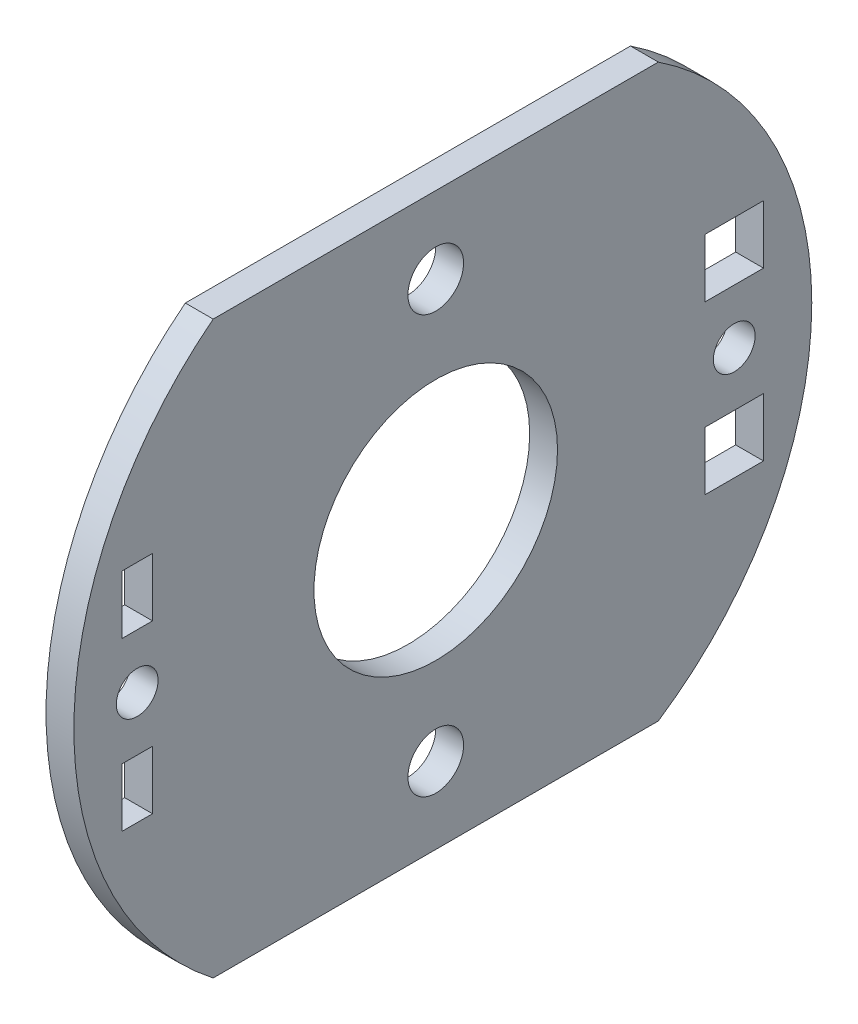
ISO-10303-21;
HEADER;
FILE_DESCRIPTION(('STEP AP214'),'2;1');
FILE_NAME('part.step','',(''),(''),'','','');
FILE_SCHEMA(('AUTOMOTIVE_DESIGN { 1 0 10303 214 1 1 1 1 }'));
ENDSEC;
DATA;
#1=APPLICATION_CONTEXT('core data for automotive mechanical design processes');
#2=APPLICATION_PROTOCOL_DEFINITION('international standard','automotive_design',2000,#1);
#3=PRODUCT_CONTEXT('',#1,'mechanical');
#4=PRODUCT('Part','Part','',(#3));
#5=PRODUCT_RELATED_PRODUCT_CATEGORY('part','',(#4));
#6=PRODUCT_DEFINITION_FORMATION('','',#4);
#7=PRODUCT_DEFINITION_CONTEXT('part definition',#1,'design');
#8=PRODUCT_DEFINITION('design','',#6,#7);
#9=PRODUCT_DEFINITION_SHAPE('','',#8);
#10=(LENGTH_UNIT() NAMED_UNIT(*) SI_UNIT(.MILLI.,.METRE.));
#11=(NAMED_UNIT(*) PLANE_ANGLE_UNIT() SI_UNIT($,.RADIAN.));
#12=(NAMED_UNIT(*) SI_UNIT($,.STERADIAN.) SOLID_ANGLE_UNIT());
#13=UNCERTAINTY_MEASURE_WITH_UNIT(LENGTH_MEASURE(1.E-05),#10,'distance_accuracy_value','');
#14=(GEOMETRIC_REPRESENTATION_CONTEXT(3) GLOBAL_UNCERTAINTY_ASSIGNED_CONTEXT((#13)) GLOBAL_UNIT_ASSIGNED_CONTEXT((#10,
#11,#12)) REPRESENTATION_CONTEXT('',''));
#15=CARTESIAN_POINT('',(0.,0.,0.));
#16=DIRECTION('',(0.,0.,1.));
#17=DIRECTION('',(1.,0.,0.));
#18=AXIS2_PLACEMENT_3D('',#15,#16,#17);
#19=CARTESIAN_POINT('',(2.,0.,-21.45));
#20=DIRECTION('',(-1.,0.,0.));
#21=DIRECTION('',(0.,0.,1.));
#22=AXIS2_PLACEMENT_3D('',#19,#20,#21);
#23=PLANE('',#22);
#24=DIRECTION('',(0.,0.,1.));
#25=VECTOR('',#24,1.);
#26=CARTESIAN_POINT('',(2.,-3.90000000000011,1.09999999999998));
#27=LINE('',#26,#25);
#28=CARTESIAN_POINT('',(2.,-3.9000000000001,-1.10000000000003));
#29=VERTEX_POINT('',#28);
#30=CARTESIAN_POINT('',(2.,-3.90000000000011,1.09999999999998));
#31=VERTEX_POINT('',#30);
#32=EDGE_CURVE('E211',#29,#31,#27,.T.);
#33=ORIENTED_EDGE('',*,*,#32,.F.);
#34=DIRECTION('',(0.,1.,0.));
#35=VECTOR('',#34,1.);
#36=CARTESIAN_POINT('',(2.,-3.9000000000001,-1.10000000000003));
#37=LINE('',#36,#35);
#38=CARTESIAN_POINT('',(2.,-8.1,-1.10000000000028));
#39=VERTEX_POINT('',#38);
#40=EDGE_CURVE('E219',#39,#29,#37,.T.);
#41=ORIENTED_EDGE('',*,*,#40,.F.);
#42=DIRECTION('',(0.,0.,-1.));
#43=VECTOR('',#42,1.);
#44=CARTESIAN_POINT('',(2.,-8.10000000000001,1.09999999999996));
#45=LINE('',#44,#43);
#46=CARTESIAN_POINT('',(2.,-8.10000000000001,1.09999999999996));
#47=VERTEX_POINT('',#46);
#48=EDGE_CURVE('E216',#47,#39,#45,.T.);
#49=ORIENTED_EDGE('',*,*,#48,.F.);
#50=DIRECTION('',(0.,-1.,0.));
#51=VECTOR('',#50,1.);
#52=CARTESIAN_POINT('',(2.,-3.90000000000011,1.09999999999998));
#53=LINE('',#52,#51);
#54=EDGE_CURVE('E213',#31,#47,#53,.T.);
#55=ORIENTED_EDGE('',*,*,#54,.F.);
#56=EDGE_LOOP('',(#33,#41,#49,#55));
#57=FACE_BOUND('',#56,.T.);
#58=CARTESIAN_POINT('',(2.,0.,-21.45));
#59=DIRECTION('',(1.,0.,0.));
#60=DIRECTION('',(0.,0.,-1.));
#61=AXIS2_PLACEMENT_3D('',#58,#59,#60);
#62=CIRCLE('',#61,8.75);
#63=CARTESIAN_POINT('',(2.,0.,-30.2));
#64=VERTEX_POINT('',#63);
#65=EDGE_CURVE('E273',#64,#64,#62,.T.);
#66=ORIENTED_EDGE('',*,*,#65,.F.);
#67=EDGE_LOOP('',(#66));
#68=FACE_BOUND('',#67,.T.);
#69=CARTESIAN_POINT('',(2.,-15.,-21.45));
#70=DIRECTION('',(1.,0.,0.));
#71=DIRECTION('',(0.,0.,-1.));
#72=AXIS2_PLACEMENT_3D('',#69,#70,#71);
#73=CIRCLE('',#72,2.);
#74=CARTESIAN_POINT('',(2.,-15.,-23.45));
#75=VERTEX_POINT('',#74);
#76=EDGE_CURVE('E279',#75,#75,#73,.T.);
#77=ORIENTED_EDGE('',*,*,#76,.F.);
#78=EDGE_LOOP('',(#77));
#79=FACE_BOUND('',#78,.T.);
#80=CARTESIAN_POINT('',(2.,15.,-21.45));
#81=DIRECTION('',(1.,0.,0.));
#82=DIRECTION('',(0.,0.,-1.));
#83=AXIS2_PLACEMENT_3D('',#80,#81,#82);
#84=CIRCLE('',#83,2.);
#85=CARTESIAN_POINT('',(2.,15.,-23.45));
#86=VERTEX_POINT('',#85);
#87=EDGE_CURVE('E285',#86,#86,#84,.T.);
#88=ORIENTED_EDGE('',*,*,#87,.F.);
#89=EDGE_LOOP('',(#88));
#90=FACE_BOUND('',#89,.T.);
#91=DIRECTION('',(0.,1.,0.));
#92=VECTOR('',#91,1.);
#93=CARTESIAN_POINT('',(2.,-3.90000000000006,-45.));
#94=LINE('',#93,#92);
#95=CARTESIAN_POINT('',(2.,-8.10000000000006,-45.));
#96=VERTEX_POINT('',#95);
#97=CARTESIAN_POINT('',(2.,-3.90000000000006,-45.));
#98=VERTEX_POINT('',#97);
#99=EDGE_CURVE('E291',#96,#98,#94,.T.);
#100=ORIENTED_EDGE('',*,*,#99,.F.);
#101=DIRECTION('',(0.,0.,-1.));
#102=VECTOR('',#101,1.);
#103=CARTESIAN_POINT('',(2.,-8.10000000000006,-40.8));
#104=LINE('',#103,#102);
#105=CARTESIAN_POINT('',(2.,-8.10000000000006,-40.8));
#106=VERTEX_POINT('',#105);
#107=EDGE_CURVE('E299',#106,#96,#104,.T.);
#108=ORIENTED_EDGE('',*,*,#107,.F.);
#109=DIRECTION('',(0.,-1.,0.));
#110=VECTOR('',#109,1.);
#111=CARTESIAN_POINT('',(2.,-3.90000000000006,-40.8));
#112=LINE('',#111,#110);
#113=CARTESIAN_POINT('',(2.,-3.90000000000006,-40.8));
#114=VERTEX_POINT('',#113);
#115=EDGE_CURVE('E296',#114,#106,#112,.T.);
#116=ORIENTED_EDGE('',*,*,#115,.F.);
#117=DIRECTION('',(0.,0.,1.));
#118=VECTOR('',#117,1.);
#119=CARTESIAN_POINT('',(2.,-3.90000000000006,-40.8));
#120=LINE('',#119,#118);
#121=EDGE_CURVE('E293',#98,#114,#120,.T.);
#122=ORIENTED_EDGE('',*,*,#121,.F.);
#123=EDGE_LOOP('',(#100,#108,#116,#122));
#124=FACE_BOUND('',#123,.T.);
#125=DIRECTION('',(0.,0.,1.));
#126=VECTOR('',#125,1.);
#127=CARTESIAN_POINT('',(2.,20.5,-21.45));
#128=LINE('',#127,#126);
#129=CARTESIAN_POINT('',(2.,20.5,-37.4421855917195));
#130=VERTEX_POINT('',#129);
#131=CARTESIAN_POINT('',(2.,20.5,-5.45781440828052));
#132=VERTEX_POINT('',#131);
#133=EDGE_CURVE('E322',#130,#132,#128,.T.);
#134=ORIENTED_EDGE('',*,*,#133,.T.);
#135=CARTESIAN_POINT('',(2.,0.,-21.45));
#136=DIRECTION('',(1.,0.,0.));
#137=DIRECTION('',(0.,0.,1.));
#138=AXIS2_PLACEMENT_3D('',#135,#136,#137);
#139=CIRCLE('',#138,26.);
#140=CARTESIAN_POINT('',(2.,-20.5,-5.45781440828052));
#141=VERTEX_POINT('',#140);
#142=EDGE_CURVE('E325',#132,#141,#139,.T.);
#143=ORIENTED_EDGE('',*,*,#142,.T.);
#144=DIRECTION('',(0.,0.,-1.));
#145=VECTOR('',#144,1.);
#146=CARTESIAN_POINT('',(2.,-20.5,-21.45));
#147=LINE('',#146,#145);
#148=CARTESIAN_POINT('',(2.,-20.5,-37.4421855917195));
#149=VERTEX_POINT('',#148);
#150=EDGE_CURVE('E328',#141,#149,#147,.T.);
#151=ORIENTED_EDGE('',*,*,#150,.T.);
#152=CARTESIAN_POINT('',(2.,0.,-23.8991572908042));
#153=DIRECTION('',(1.,0.,0.));
#154=DIRECTION('',(0.,0.,1.));
#155=AXIS2_PLACEMENT_3D('',#152,#153,#154);
#156=CIRCLE('',#155,24.5695668573826);
#157=EDGE_CURVE('E330',#149,#130,#156,.T.);
#158=ORIENTED_EDGE('',*,*,#157,.T.);
#159=EDGE_LOOP('',(#134,#143,#151,#158));
#160=FACE_BOUND('',#159,.T.);
#161=DIRECTION('',(0.,-1.,0.));
#162=VECTOR('',#161,1.);
#163=CARTESIAN_POINT('',(2.,3.90000000000006,-40.8));
#164=LINE('',#163,#162);
#165=CARTESIAN_POINT('',(2.,8.10000000000006,-40.8));
#166=VERTEX_POINT('',#165);
#167=CARTESIAN_POINT('',(2.,3.90000000000006,-40.8));
#168=VERTEX_POINT('',#167);
#169=EDGE_CURVE('E242',#166,#168,#164,.T.);
#170=ORIENTED_EDGE('',*,*,#169,.F.);
#171=DIRECTION('',(0.,0.,1.));
#172=VECTOR('',#171,1.);
#173=CARTESIAN_POINT('',(2.,8.10000000000006,-40.8));
#174=LINE('',#173,#172);
#175=CARTESIAN_POINT('',(2.,8.10000000000006,-45.));
#176=VERTEX_POINT('',#175);
#177=EDGE_CURVE('E250',#176,#166,#174,.T.);
#178=ORIENTED_EDGE('',*,*,#177,.F.);
#179=DIRECTION('',(0.,1.,0.));
#180=VECTOR('',#179,1.);
#181=CARTESIAN_POINT('',(2.,3.90000000000006,-45.));
#182=LINE('',#181,#180);
#183=CARTESIAN_POINT('',(2.,3.90000000000006,-45.));
#184=VERTEX_POINT('',#183);
#185=EDGE_CURVE('E247',#184,#176,#182,.T.);
#186=ORIENTED_EDGE('',*,*,#185,.F.);
#187=DIRECTION('',(0.,0.,-1.));
#188=VECTOR('',#187,1.);
#189=CARTESIAN_POINT('',(2.,3.90000000000006,-40.8));
#190=LINE('',#189,#188);
#191=EDGE_CURVE('E244',#168,#184,#190,.T.);
#192=ORIENTED_EDGE('',*,*,#191,.F.);
#193=EDGE_LOOP('',(#170,#178,#186,#192));
#194=FACE_BOUND('',#193,.T.);
#195=DIRECTION('',(0.,0.,1.));
#196=VECTOR('',#195,1.);
#197=CARTESIAN_POINT('',(2.,8.10000000000009,1.10000000000002));
#198=LINE('',#197,#196);
#199=CARTESIAN_POINT('',(2.,8.10000000000009,-1.09999999999999));
#200=VERTEX_POINT('',#199);
#201=CARTESIAN_POINT('',(2.,8.10000000000009,1.10000000000002));
#202=VERTEX_POINT('',#201);
#203=EDGE_CURVE('E172',#200,#202,#198,.T.);
#204=ORIENTED_EDGE('',*,*,#203,.F.);
#205=DIRECTION('',(0.,1.,0.));
#206=VECTOR('',#205,1.);
#207=CARTESIAN_POINT('',(2.,3.90000000000008,-1.09999999999998));
#208=LINE('',#207,#206);
#209=CARTESIAN_POINT('',(2.,3.90000000000008,-1.09999999999997));
#210=VERTEX_POINT('',#209);
#211=EDGE_CURVE('E195',#210,#200,#208,.T.);
#212=ORIENTED_EDGE('',*,*,#211,.F.);
#213=DIRECTION('',(0.,0.,-1.));
#214=VECTOR('',#213,1.);
#215=CARTESIAN_POINT('',(2.,3.90000000000009,1.1));
#216=LINE('',#215,#214);
#217=CARTESIAN_POINT('',(2.,3.90000000000009,1.1));
#218=VERTEX_POINT('',#217);
#219=EDGE_CURVE('E193',#218,#210,#216,.T.);
#220=ORIENTED_EDGE('',*,*,#219,.F.);
#221=DIRECTION('',(0.,-1.,0.));
#222=VECTOR('',#221,1.);
#223=CARTESIAN_POINT('',(2.,3.90000000000009,1.1));
#224=LINE('',#223,#222);
#225=EDGE_CURVE('E180',#202,#218,#224,.T.);
#226=ORIENTED_EDGE('',*,*,#225,.F.);
#227=EDGE_LOOP('',(#204,#212,#220,#226));
#228=FACE_BOUND('',#227,.T.);
#229=CARTESIAN_POINT('',(2.,0.,0.));
#230=DIRECTION('',(1.,0.,0.));
#231=DIRECTION('',(0.,0.,-1.));
#232=AXIS2_PLACEMENT_3D('',#229,#230,#231);
#233=CIRCLE('',#232,1.5);
#234=CARTESIAN_POINT('',(2.,0.,-1.5));
#235=VERTEX_POINT('',#234);
#236=EDGE_CURVE('E201',#235,#235,#233,.T.);
#237=ORIENTED_EDGE('',*,*,#236,.F.);
#238=EDGE_LOOP('',(#237));
#239=FACE_BOUND('',#238,.T.);
#240=CARTESIAN_POINT('',(2.,0.,-42.9));
#241=DIRECTION('',(1.,0.,0.));
#242=DIRECTION('',(0.,0.,-1.));
#243=AXIS2_PLACEMENT_3D('',#240,#241,#242);
#244=CIRCLE('',#243,1.5);
#245=CARTESIAN_POINT('',(2.,0.,-44.4));
#246=VERTEX_POINT('',#245);
#247=EDGE_CURVE('E629',#246,#246,#244,.T.);
#248=ORIENTED_EDGE('',*,*,#247,.F.);
#249=EDGE_LOOP('',(#248));
#250=FACE_BOUND('',#249,.T.);
#251=ADVANCED_FACE('F35',(#57,#68,#79,#90,#124,#160,#194,#228,#239,#250),#23,.F.);
#252=CARTESIAN_POINT('',(0.,0.,-21.45));
#253=DIRECTION('',(-1.,0.,0.));
#254=DIRECTION('',(0.,0.,1.));
#255=AXIS2_PLACEMENT_3D('',#252,#253,#254);
#256=PLANE('',#255);
#257=CARTESIAN_POINT('',(0.,0.,0.));
#258=DIRECTION('',(1.,0.,0.));
#259=DIRECTION('',(0.,0.,-1.));
#260=AXIS2_PLACEMENT_3D('',#257,#258,#259);
#261=CIRCLE('',#260,1.5);
#262=CARTESIAN_POINT('',(0.,0.,-1.5));
#263=VERTEX_POINT('',#262);
#264=EDGE_CURVE('E635',#263,#263,#261,.T.);
#265=ORIENTED_EDGE('',*,*,#264,.T.);
#266=EDGE_LOOP('',(#265));
#267=FACE_BOUND('',#266,.T.);
#268=CARTESIAN_POINT('',(0.,-15.,-21.45));
#269=DIRECTION('',(1.,0.,0.));
#270=DIRECTION('',(0.,0.,-1.));
#271=AXIS2_PLACEMENT_3D('',#268,#269,#270);
#272=CIRCLE('',#271,2.);
#273=CARTESIAN_POINT('',(0.,-15.,-23.45));
#274=VERTEX_POINT('',#273);
#275=EDGE_CURVE('E276',#274,#274,#272,.T.);
#276=ORIENTED_EDGE('',*,*,#275,.T.);
#277=EDGE_LOOP('',(#276));
#278=FACE_BOUND('',#277,.T.);
#279=DIRECTION('',(0.,0.,-1.));
#280=VECTOR('',#279,1.);
#281=CARTESIAN_POINT('',(0.,-8.10000000000006,-40.8));
#282=LINE('',#281,#280);
#283=CARTESIAN_POINT('',(0.,-8.10000000000006,-40.8));
#284=VERTEX_POINT('',#283);
#285=CARTESIAN_POINT('',(0.,-8.10000000000006,-45.));
#286=VERTEX_POINT('',#285);
#287=EDGE_CURVE('E294',#284,#286,#282,.T.);
#288=ORIENTED_EDGE('',*,*,#287,.T.);
#289=DIRECTION('',(0.,1.,0.));
#290=VECTOR('',#289,1.);
#291=CARTESIAN_POINT('',(0.,-3.90000000000006,-45.));
#292=LINE('',#291,#290);
#293=CARTESIAN_POINT('',(0.,-3.90000000000006,-45.));
#294=VERTEX_POINT('',#293);
#295=EDGE_CURVE('E288',#286,#294,#292,.T.);
#296=ORIENTED_EDGE('',*,*,#295,.T.);
#297=DIRECTION('',(0.,0.,1.));
#298=VECTOR('',#297,1.);
#299=CARTESIAN_POINT('',(0.,-3.90000000000006,-40.8));
#300=LINE('',#299,#298);
#301=CARTESIAN_POINT('',(0.,-3.90000000000006,-40.8));
#302=VERTEX_POINT('',#301);
#303=EDGE_CURVE('E304',#294,#302,#300,.T.);
#304=ORIENTED_EDGE('',*,*,#303,.T.);
#305=DIRECTION('',(0.,-1.,0.));
#306=VECTOR('',#305,1.);
#307=CARTESIAN_POINT('',(0.,-3.90000000000006,-40.8));
#308=LINE('',#307,#306);
#309=EDGE_CURVE('E307',#302,#284,#308,.T.);
#310=ORIENTED_EDGE('',*,*,#309,.T.);
#311=EDGE_LOOP('',(#288,#296,#304,#310));
#312=FACE_BOUND('',#311,.T.);
#313=CARTESIAN_POINT('',(0.,0.,-21.45));
#314=DIRECTION('',(1.,0.,0.));
#315=DIRECTION('',(0.,0.,1.));
#316=AXIS2_PLACEMENT_3D('',#313,#314,#315);
#317=CIRCLE('',#316,26.);
#318=CARTESIAN_POINT('',(0.,20.5,-5.45781440828052));
#319=VERTEX_POINT('',#318);
#320=CARTESIAN_POINT('',(0.,-20.5,-5.45781440828052));
#321=VERTEX_POINT('',#320);
#322=EDGE_CURVE('E321',#319,#321,#317,.T.);
#323=ORIENTED_EDGE('',*,*,#322,.F.);
#324=DIRECTION('',(0.,0.,1.));
#325=VECTOR('',#324,1.);
#326=CARTESIAN_POINT('',(0.,20.5,-21.45));
#327=LINE('',#326,#325);
#328=CARTESIAN_POINT('',(0.,20.5,-37.4421855917195));
#329=VERTEX_POINT('',#328);
#330=EDGE_CURVE('E326',#329,#319,#327,.T.);
#331=ORIENTED_EDGE('',*,*,#330,.F.);
#332=CARTESIAN_POINT('',(0.,0.,-23.8991572908042));
#333=DIRECTION('',(1.,0.,0.));
#334=DIRECTION('',(0.,0.,1.));
#335=AXIS2_PLACEMENT_3D('',#332,#333,#334);
#336=CIRCLE('',#335,24.5695668573826);
#337=CARTESIAN_POINT('',(0.,-20.5,-37.4421855917195));
#338=VERTEX_POINT('',#337);
#339=EDGE_CURVE('E338',#338,#329,#336,.T.);
#340=ORIENTED_EDGE('',*,*,#339,.F.);
#341=DIRECTION('',(0.,0.,-1.));
#342=VECTOR('',#341,1.);
#343=CARTESIAN_POINT('',(0.,-20.5,-21.45));
#344=LINE('',#343,#342);
#345=EDGE_CURVE('E336',#321,#338,#344,.T.);
#346=ORIENTED_EDGE('',*,*,#345,.F.);
#347=EDGE_LOOP('',(#323,#331,#340,#346));
#348=FACE_BOUND('',#347,.T.);
#349=CARTESIAN_POINT('',(0.,15.,-21.45));
#350=DIRECTION('',(1.,0.,0.));
#351=DIRECTION('',(0.,0.,-1.));
#352=AXIS2_PLACEMENT_3D('',#349,#350,#351);
#353=CIRCLE('',#352,2.);
#354=CARTESIAN_POINT('',(0.,15.,-23.45));
#355=VERTEX_POINT('',#354);
#356=EDGE_CURVE('E282',#355,#355,#353,.T.);
#357=ORIENTED_EDGE('',*,*,#356,.T.);
#358=EDGE_LOOP('',(#357));
#359=FACE_BOUND('',#358,.T.);
#360=CARTESIAN_POINT('',(0.,0.,-21.45));
#361=DIRECTION('',(1.,0.,0.));
#362=DIRECTION('',(0.,0.,-1.));
#363=AXIS2_PLACEMENT_3D('',#360,#361,#362);
#364=CIRCLE('',#363,8.75);
#365=CARTESIAN_POINT('',(0.,0.,-30.2));
#366=VERTEX_POINT('',#365);
#367=EDGE_CURVE('E272',#366,#366,#364,.T.);
#368=ORIENTED_EDGE('',*,*,#367,.T.);
#369=EDGE_LOOP('',(#368));
#370=FACE_BOUND('',#369,.T.);
#371=DIRECTION('',(0.,0.,1.));
#372=VECTOR('',#371,1.);
#373=CARTESIAN_POINT('',(0.,8.10000000000006,-40.8));
#374=LINE('',#373,#372);
#375=CARTESIAN_POINT('',(0.,8.10000000000006,-45.));
#376=VERTEX_POINT('',#375);
#377=CARTESIAN_POINT('',(0.,8.10000000000006,-40.8));
#378=VERTEX_POINT('',#377);
#379=EDGE_CURVE('E245',#376,#378,#374,.T.);
#380=ORIENTED_EDGE('',*,*,#379,.T.);
#381=DIRECTION('',(0.,-1.,0.));
#382=VECTOR('',#381,1.);
#383=CARTESIAN_POINT('',(0.,3.90000000000006,-40.8));
#384=LINE('',#383,#382);
#385=CARTESIAN_POINT('',(0.,3.90000000000006,-40.8));
#386=VERTEX_POINT('',#385);
#387=EDGE_CURVE('E241',#378,#386,#384,.T.);
#388=ORIENTED_EDGE('',*,*,#387,.T.);
#389=DIRECTION('',(0.,0.,-1.));
#390=VECTOR('',#389,1.);
#391=CARTESIAN_POINT('',(0.,3.90000000000006,-40.8));
#392=LINE('',#391,#390);
#393=CARTESIAN_POINT('',(0.,3.90000000000006,-45.));
#394=VERTEX_POINT('',#393);
#395=EDGE_CURVE('E255',#386,#394,#392,.T.);
#396=ORIENTED_EDGE('',*,*,#395,.T.);
#397=DIRECTION('',(0.,1.,0.));
#398=VECTOR('',#397,1.);
#399=CARTESIAN_POINT('',(0.,3.90000000000006,-45.));
#400=LINE('',#399,#398);
#401=EDGE_CURVE('E258',#394,#376,#400,.T.);
#402=ORIENTED_EDGE('',*,*,#401,.T.);
#403=EDGE_LOOP('',(#380,#388,#396,#402));
#404=FACE_BOUND('',#403,.T.);
#405=DIRECTION('',(0.,1.,0.));
#406=VECTOR('',#405,1.);
#407=CARTESIAN_POINT('',(0.,-3.9000000000001,-1.10000000000003));
#408=LINE('',#407,#406);
#409=CARTESIAN_POINT('',(0.,-8.1,-1.10000000000028));
#410=VERTEX_POINT('',#409);
#411=CARTESIAN_POINT('',(0.,-3.9000000000001,-1.10000000000003));
#412=VERTEX_POINT('',#411);
#413=EDGE_CURVE('E214',#410,#412,#408,.T.);
#414=ORIENTED_EDGE('',*,*,#413,.T.);
#415=DIRECTION('',(0.,0.,1.));
#416=VECTOR('',#415,1.);
#417=CARTESIAN_POINT('',(0.,-3.90000000000011,1.09999999999998));
#418=LINE('',#417,#416);
#419=CARTESIAN_POINT('',(0.,-3.90000000000011,1.09999999999998));
#420=VERTEX_POINT('',#419);
#421=EDGE_CURVE('E188',#412,#420,#418,.T.);
#422=ORIENTED_EDGE('',*,*,#421,.T.);
#423=DIRECTION('',(0.,-1.,0.));
#424=VECTOR('',#423,1.);
#425=CARTESIAN_POINT('',(0.,-3.90000000000011,1.09999999999998));
#426=LINE('',#425,#424);
#427=CARTESIAN_POINT('',(0.,-8.10000000000001,1.09999999999996));
#428=VERTEX_POINT('',#427);
#429=EDGE_CURVE('E224',#420,#428,#426,.T.);
#430=ORIENTED_EDGE('',*,*,#429,.T.);
#431=DIRECTION('',(0.,0.,-1.));
#432=VECTOR('',#431,1.);
#433=CARTESIAN_POINT('',(0.,-8.10000000000001,1.09999999999996));
#434=LINE('',#433,#432);
#435=EDGE_CURVE('E227',#428,#410,#434,.T.);
#436=ORIENTED_EDGE('',*,*,#435,.T.);
#437=EDGE_LOOP('',(#414,#422,#430,#436));
#438=FACE_BOUND('',#437,.T.);
#439=DIRECTION('',(0.,1.,0.));
#440=VECTOR('',#439,1.);
#441=CARTESIAN_POINT('',(0.,3.90000000000008,-1.09999999999998));
#442=LINE('',#441,#440);
#443=CARTESIAN_POINT('',(0.,3.90000000000008,-1.09999999999998));
#444=VERTEX_POINT('',#443);
#445=CARTESIAN_POINT('',(0.,8.10000000000009,-1.09999999999999));
#446=VERTEX_POINT('',#445);
#447=EDGE_CURVE('E181',#444,#446,#442,.T.);
#448=ORIENTED_EDGE('',*,*,#447,.T.);
#449=DIRECTION('',(0.,0.,1.));
#450=VECTOR('',#449,1.);
#451=CARTESIAN_POINT('',(0.,8.10000000000009,1.10000000000002));
#452=LINE('',#451,#450);
#453=CARTESIAN_POINT('',(0.,8.10000000000009,1.10000000000002));
#454=VERTEX_POINT('',#453);
#455=EDGE_CURVE('E58',#446,#454,#452,.T.);
#456=ORIENTED_EDGE('',*,*,#455,.T.);
#457=DIRECTION('',(0.,-1.,0.));
#458=VECTOR('',#457,1.);
#459=CARTESIAN_POINT('',(0.,3.90000000000009,1.1));
#460=LINE('',#459,#458);
#461=CARTESIAN_POINT('',(0.,3.90000000000009,1.1));
#462=VERTEX_POINT('',#461);
#463=EDGE_CURVE('E187',#454,#462,#460,.T.);
#464=ORIENTED_EDGE('',*,*,#463,.T.);
#465=DIRECTION('',(0.,0.,-1.));
#466=VECTOR('',#465,1.);
#467=CARTESIAN_POINT('',(0.,3.90000000000009,1.1));
#468=LINE('',#467,#466);
#469=EDGE_CURVE('E203',#462,#444,#468,.T.);
#470=ORIENTED_EDGE('',*,*,#469,.T.);
#471=EDGE_LOOP('',(#448,#456,#464,#470));
#472=FACE_BOUND('',#471,.T.);
#473=CARTESIAN_POINT('',(0.,0.,-42.9));
#474=DIRECTION('',(1.,0.,0.));
#475=DIRECTION('',(0.,0.,-1.));
#476=AXIS2_PLACEMENT_3D('',#473,#474,#475);
#477=CIRCLE('',#476,1.5);
#478=CARTESIAN_POINT('',(0.,0.,-44.4));
#479=VERTEX_POINT('',#478);
#480=EDGE_CURVE('E632',#479,#479,#477,.T.);
#481=ORIENTED_EDGE('',*,*,#480,.T.);
#482=EDGE_LOOP('',(#481));
#483=FACE_BOUND('',#482,.T.);
#484=ADVANCED_FACE('F356',(#267,#278,#312,#348,#359,#370,#404,#438,#472,#483),#256,.T.);
#485=CARTESIAN_POINT('',(2.,0.,-21.45));
#486=DIRECTION('',(-1.,0.,0.));
#487=DIRECTION('',(0.,0.,1.));
#488=AXIS2_PLACEMENT_3D('',#485,#486,#487);
#489=CYLINDRICAL_SURFACE('',#488,26.);
#490=ORIENTED_EDGE('',*,*,#322,.T.);
#491=DIRECTION('',(-1.,0.,0.));
#492=VECTOR('',#491,1.);
#493=CARTESIAN_POINT('',(2.,-20.5,-5.45781440828052));
#494=LINE('',#493,#492);
#495=EDGE_CURVE('E43',#141,#321,#494,.T.);
#496=ORIENTED_EDGE('',*,*,#495,.F.);
#497=ORIENTED_EDGE('',*,*,#142,.F.);
#498=DIRECTION('',(-1.,0.,0.));
#499=VECTOR('',#498,1.);
#500=CARTESIAN_POINT('',(2.,20.5,-5.45781440828052));
#501=LINE('',#500,#499);
#502=EDGE_CURVE('E11',#132,#319,#501,.T.);
#503=ORIENTED_EDGE('',*,*,#502,.T.);
#504=EDGE_LOOP('',(#490,#496,#497,#503));
#505=FACE_BOUND('',#504,.T.);
#506=ADVANCED_FACE('F37',(#505),#489,.T.);
#507=CARTESIAN_POINT('',(2.,-20.5,-21.45));
#508=DIRECTION('',(0.,1.,0.));
#509=DIRECTION('',(0.,0.,1.));
#510=AXIS2_PLACEMENT_3D('',#507,#508,#509);
#511=PLANE('',#510);
#512=ORIENTED_EDGE('',*,*,#345,.T.);
#513=DIRECTION('',(-1.,0.,0.));
#514=VECTOR('',#513,1.);
#515=CARTESIAN_POINT('',(2.,-20.5,-37.4421855917195));
#516=LINE('',#515,#514);
#517=EDGE_CURVE('E343',#149,#338,#516,.T.);
#518=ORIENTED_EDGE('',*,*,#517,.F.);
#519=ORIENTED_EDGE('',*,*,#150,.F.);
#520=ORIENTED_EDGE('',*,*,#495,.T.);
#521=EDGE_LOOP('',(#512,#518,#519,#520));
#522=FACE_BOUND('',#521,.T.);
#523=ADVANCED_FACE('F349',(#522),#511,.F.);
#524=CARTESIAN_POINT('',(2.,0.,-23.8991572908042));
#525=DIRECTION('',(-1.,0.,0.));
#526=DIRECTION('',(0.,0.,1.));
#527=AXIS2_PLACEMENT_3D('',#524,#525,#526);
#528=CYLINDRICAL_SURFACE('',#527,24.5695668573826);
#529=ORIENTED_EDGE('',*,*,#339,.T.);
#530=DIRECTION('',(-1.,0.,0.));
#531=VECTOR('',#530,1.);
#532=CARTESIAN_POINT('',(2.,20.5,-37.4421855917195));
#533=LINE('',#532,#531);
#534=EDGE_CURVE('E333',#130,#329,#533,.T.);
#535=ORIENTED_EDGE('',*,*,#534,.F.);
#536=ORIENTED_EDGE('',*,*,#157,.F.);
#537=ORIENTED_EDGE('',*,*,#517,.T.);
#538=EDGE_LOOP('',(#529,#535,#536,#537));
#539=FACE_BOUND('',#538,.T.);
#540=ADVANCED_FACE('F361',(#539),#528,.T.);
#541=CARTESIAN_POINT('',(2.,20.5,-21.45));
#542=DIRECTION('',(0.,-1.,0.));
#543=DIRECTION('',(0.,0.,-1.));
#544=AXIS2_PLACEMENT_3D('',#541,#542,#543);
#545=PLANE('',#544);
#546=ORIENTED_EDGE('',*,*,#330,.T.);
#547=ORIENTED_EDGE('',*,*,#502,.F.);
#548=ORIENTED_EDGE('',*,*,#133,.F.);
#549=ORIENTED_EDGE('',*,*,#534,.T.);
#550=EDGE_LOOP('',(#546,#547,#548,#549));
#551=FACE_BOUND('',#550,.T.);
#552=ADVANCED_FACE('F364',(#551),#545,.F.);
#553=CARTESIAN_POINT('',(2.,-3.90000000000006,-45.));
#554=DIRECTION('',(0.,0.,1.));
#555=DIRECTION('',(1.,0.,0.));
#556=AXIS2_PLACEMENT_3D('',#553,#554,#555);
#557=PLANE('',#556);
#558=ORIENTED_EDGE('',*,*,#295,.F.);
#559=DIRECTION('',(-1.,0.,0.));
#560=VECTOR('',#559,1.);
#561=CARTESIAN_POINT('',(2.,-8.10000000000006,-45.));
#562=LINE('',#561,#560);
#563=EDGE_CURVE('E301',#96,#286,#562,.T.);
#564=ORIENTED_EDGE('',*,*,#563,.F.);
#565=ORIENTED_EDGE('',*,*,#99,.T.);
#566=DIRECTION('',(-1.,0.,0.));
#567=VECTOR('',#566,1.);
#568=CARTESIAN_POINT('',(2.,-3.90000000000006,-45.));
#569=LINE('',#568,#567);
#570=EDGE_CURVE('E318',#98,#294,#569,.T.);
#571=ORIENTED_EDGE('',*,*,#570,.T.);
#572=EDGE_LOOP('',(#558,#564,#565,#571));
#573=FACE_BOUND('',#572,.T.);
#574=ADVANCED_FACE('F425',(#573),#557,.T.);
#575=CARTESIAN_POINT('',(2.,-3.90000000000006,-40.8));
#576=DIRECTION('',(0.,-1.,0.));
#577=DIRECTION('',(0.,0.,-1.));
#578=AXIS2_PLACEMENT_3D('',#575,#576,#577);
#579=PLANE('',#578);
#580=ORIENTED_EDGE('',*,*,#303,.F.);
#581=ORIENTED_EDGE('',*,*,#570,.F.);
#582=ORIENTED_EDGE('',*,*,#121,.T.);
#583=DIRECTION('',(-1.,0.,0.));
#584=VECTOR('',#583,1.);
#585=CARTESIAN_POINT('',(2.,-3.90000000000006,-40.8));
#586=LINE('',#585,#584);
#587=EDGE_CURVE('E316',#114,#302,#586,.T.);
#588=ORIENTED_EDGE('',*,*,#587,.T.);
#589=EDGE_LOOP('',(#580,#581,#582,#588));
#590=FACE_BOUND('',#589,.T.);
#591=ADVANCED_FACE('F421',(#590),#579,.T.);
#592=CARTESIAN_POINT('',(2.,-3.90000000000006,-40.8));
#593=DIRECTION('',(0.,0.,-1.));
#594=DIRECTION('',(-1.,0.,0.));
#595=AXIS2_PLACEMENT_3D('',#592,#593,#594);
#596=PLANE('',#595);
#597=ORIENTED_EDGE('',*,*,#309,.F.);
#598=ORIENTED_EDGE('',*,*,#587,.F.);
#599=ORIENTED_EDGE('',*,*,#115,.T.);
#600=DIRECTION('',(-1.,0.,0.));
#601=VECTOR('',#600,1.);
#602=CARTESIAN_POINT('',(2.,-8.10000000000006,-40.8));
#603=LINE('',#602,#601);
#604=EDGE_CURVE('E314',#106,#284,#603,.T.);
#605=ORIENTED_EDGE('',*,*,#604,.T.);
#606=EDGE_LOOP('',(#597,#598,#599,#605));
#607=FACE_BOUND('',#606,.T.);
#608=ADVANCED_FACE('F417',(#607),#596,.T.);
#609=CARTESIAN_POINT('',(2.,-8.10000000000006,-40.8));
#610=DIRECTION('',(0.,1.,0.));
#611=DIRECTION('',(0.,0.,1.));
#612=AXIS2_PLACEMENT_3D('',#609,#610,#611);
#613=PLANE('',#612);
#614=ORIENTED_EDGE('',*,*,#287,.F.);
#615=ORIENTED_EDGE('',*,*,#604,.F.);
#616=ORIENTED_EDGE('',*,*,#107,.T.);
#617=ORIENTED_EDGE('',*,*,#563,.T.);
#618=EDGE_LOOP('',(#614,#615,#616,#617));
#619=FACE_BOUND('',#618,.T.);
#620=ADVANCED_FACE('F413',(#619),#613,.T.);
#621=CARTESIAN_POINT('',(2.,15.,-21.45));
#622=DIRECTION('',(-1.,0.,0.));
#623=DIRECTION('',(0.,0.,1.));
#624=AXIS2_PLACEMENT_3D('',#621,#622,#623);
#625=CYLINDRICAL_SURFACE('',#624,2.);
#626=ORIENTED_EDGE('',*,*,#87,.T.);
#627=EDGE_LOOP('',(#626));
#628=FACE_BOUND('',#627,.T.);
#629=ORIENTED_EDGE('',*,*,#356,.F.);
#630=EDGE_LOOP('',(#629));
#631=FACE_BOUND('',#630,.T.);
#632=ADVANCED_FACE('F409',(#628,#631),#625,.F.);
#633=CARTESIAN_POINT('',(2.,-15.,-21.45));
#634=DIRECTION('',(-1.,0.,0.));
#635=DIRECTION('',(0.,0.,1.));
#636=AXIS2_PLACEMENT_3D('',#633,#634,#635);
#637=CYLINDRICAL_SURFACE('',#636,2.);
#638=ORIENTED_EDGE('',*,*,#76,.T.);
#639=EDGE_LOOP('',(#638));
#640=FACE_BOUND('',#639,.T.);
#641=ORIENTED_EDGE('',*,*,#275,.F.);
#642=EDGE_LOOP('',(#641));
#643=FACE_BOUND('',#642,.T.);
#644=ADVANCED_FACE('F405',(#640,#643),#637,.F.);
#645=CARTESIAN_POINT('',(2.,0.,-21.45));
#646=DIRECTION('',(-1.,0.,0.));
#647=DIRECTION('',(0.,0.,1.));
#648=AXIS2_PLACEMENT_3D('',#645,#646,#647);
#649=CYLINDRICAL_SURFACE('',#648,8.75);
#650=ORIENTED_EDGE('',*,*,#65,.T.);
#651=EDGE_LOOP('',(#650));
#652=FACE_BOUND('',#651,.T.);
#653=ORIENTED_EDGE('',*,*,#367,.F.);
#654=EDGE_LOOP('',(#653));
#655=FACE_BOUND('',#654,.T.);
#656=ADVANCED_FACE('F402',(#652,#655),#649,.F.);
#657=CARTESIAN_POINT('',(2.,3.90000000000006,-40.8));
#658=DIRECTION('',(0.,0.,-1.));
#659=DIRECTION('',(-1.,0.,0.));
#660=AXIS2_PLACEMENT_3D('',#657,#658,#659);
#661=PLANE('',#660);
#662=ORIENTED_EDGE('',*,*,#387,.F.);
#663=DIRECTION('',(-1.,0.,0.));
#664=VECTOR('',#663,1.);
#665=CARTESIAN_POINT('',(2.,8.10000000000006,-40.8));
#666=LINE('',#665,#664);
#667=EDGE_CURVE('E252',#166,#378,#666,.T.);
#668=ORIENTED_EDGE('',*,*,#667,.F.);
#669=ORIENTED_EDGE('',*,*,#169,.T.);
#670=DIRECTION('',(-1.,0.,0.));
#671=VECTOR('',#670,1.);
#672=CARTESIAN_POINT('',(2.,3.90000000000006,-40.8));
#673=LINE('',#672,#671);
#674=EDGE_CURVE('E269',#168,#386,#673,.T.);
#675=ORIENTED_EDGE('',*,*,#674,.T.);
#676=EDGE_LOOP('',(#662,#668,#669,#675));
#677=FACE_BOUND('',#676,.T.);
#678=ADVANCED_FACE('F377',(#677),#661,.T.);
#679=CARTESIAN_POINT('',(2.,3.90000000000006,-40.8));
#680=DIRECTION('',(0.,1.,0.));
#681=DIRECTION('',(0.,0.,1.));
#682=AXIS2_PLACEMENT_3D('',#679,#680,#681);
#683=PLANE('',#682);
#684=ORIENTED_EDGE('',*,*,#395,.F.);
#685=ORIENTED_EDGE('',*,*,#674,.F.);
#686=ORIENTED_EDGE('',*,*,#191,.T.);
#687=DIRECTION('',(-1.,0.,0.));
#688=VECTOR('',#687,1.);
#689=CARTESIAN_POINT('',(2.,3.90000000000006,-45.));
#690=LINE('',#689,#688);
#691=EDGE_CURVE('E267',#184,#394,#690,.T.);
#692=ORIENTED_EDGE('',*,*,#691,.T.);
#693=EDGE_LOOP('',(#684,#685,#686,#692));
#694=FACE_BOUND('',#693,.T.);
#695=ADVANCED_FACE('F379',(#694),#683,.T.);
#696=CARTESIAN_POINT('',(2.,3.90000000000006,-45.));
#697=DIRECTION('',(0.,0.,1.));
#698=DIRECTION('',(1.,0.,0.));
#699=AXIS2_PLACEMENT_3D('',#696,#697,#698);
#700=PLANE('',#699);
#701=ORIENTED_EDGE('',*,*,#401,.F.);
#702=ORIENTED_EDGE('',*,*,#691,.F.);
#703=ORIENTED_EDGE('',*,*,#185,.T.);
#704=DIRECTION('',(-1.,0.,0.));
#705=VECTOR('',#704,1.);
#706=CARTESIAN_POINT('',(2.,8.10000000000006,-45.));
#707=LINE('',#706,#705);
#708=EDGE_CURVE('E265',#176,#376,#707,.T.);
#709=ORIENTED_EDGE('',*,*,#708,.T.);
#710=EDGE_LOOP('',(#701,#702,#703,#709));
#711=FACE_BOUND('',#710,.T.);
#712=ADVANCED_FACE('F388',(#711),#700,.T.);
#713=CARTESIAN_POINT('',(2.,8.10000000000006,-40.8));
#714=DIRECTION('',(0.,-1.,0.));
#715=DIRECTION('',(0.,0.,-1.));
#716=AXIS2_PLACEMENT_3D('',#713,#714,#715);
#717=PLANE('',#716);
#718=ORIENTED_EDGE('',*,*,#379,.F.);
#719=ORIENTED_EDGE('',*,*,#708,.F.);
#720=ORIENTED_EDGE('',*,*,#177,.T.);
#721=ORIENTED_EDGE('',*,*,#667,.T.);
#722=EDGE_LOOP('',(#718,#719,#720,#721));
#723=FACE_BOUND('',#722,.T.);
#724=ADVANCED_FACE('F386',(#723),#717,.T.);
#725=CARTESIAN_POINT('',(2.,-3.90000000000011,1.09999999999998));
#726=DIRECTION('',(0.,-1.,0.));
#727=DIRECTION('',(0.,0.,-1.));
#728=AXIS2_PLACEMENT_3D('',#725,#726,#727);
#729=PLANE('',#728);
#730=ORIENTED_EDGE('',*,*,#421,.F.);
#731=DIRECTION('',(-1.,0.,0.));
#732=VECTOR('',#731,1.);
#733=CARTESIAN_POINT('',(2.,-3.9000000000001,-1.10000000000003));
#734=LINE('',#733,#732);
#735=EDGE_CURVE('E221',#29,#412,#734,.T.);
#736=ORIENTED_EDGE('',*,*,#735,.F.);
#737=ORIENTED_EDGE('',*,*,#32,.T.);
#738=DIRECTION('',(-1.,0.,0.));
#739=VECTOR('',#738,1.);
#740=CARTESIAN_POINT('',(2.,-3.90000000000011,1.09999999999998));
#741=LINE('',#740,#739);
#742=EDGE_CURVE('E238',#31,#420,#741,.T.);
#743=ORIENTED_EDGE('',*,*,#742,.T.);
#744=EDGE_LOOP('',(#730,#736,#737,#743));
#745=FACE_BOUND('',#744,.T.);
#746=ADVANCED_FACE('F395',(#745),#729,.T.);
#747=CARTESIAN_POINT('',(2.,-3.90000000000011,1.09999999999998));
#748=DIRECTION('',(0.,0.,-1.));
#749=DIRECTION('',(0.,1.,0.));
#750=AXIS2_PLACEMENT_3D('',#747,#748,#749);
#751=PLANE('',#750);
#752=ORIENTED_EDGE('',*,*,#429,.F.);
#753=ORIENTED_EDGE('',*,*,#742,.F.);
#754=ORIENTED_EDGE('',*,*,#54,.T.);
#755=DIRECTION('',(-1.,0.,0.));
#756=VECTOR('',#755,1.);
#757=CARTESIAN_POINT('',(2.,-8.10000000000001,1.09999999999996));
#758=LINE('',#757,#756);
#759=EDGE_CURVE('E236',#47,#428,#758,.T.);
#760=ORIENTED_EDGE('',*,*,#759,.T.);
#761=EDGE_LOOP('',(#752,#753,#754,#760));
#762=FACE_BOUND('',#761,.T.);
#763=ADVANCED_FACE('F538',(#762),#751,.T.);
#764=CARTESIAN_POINT('',(2.,-8.10000000000001,1.09999999999996));
#765=DIRECTION('',(0.,1.,0.));
#766=DIRECTION('',(0.,0.,1.));
#767=AXIS2_PLACEMENT_3D('',#764,#765,#766);
#768=PLANE('',#767);
#769=ORIENTED_EDGE('',*,*,#435,.F.);
#770=ORIENTED_EDGE('',*,*,#759,.F.);
#771=ORIENTED_EDGE('',*,*,#48,.T.);
#772=DIRECTION('',(-1.,0.,0.));
#773=VECTOR('',#772,1.);
#774=CARTESIAN_POINT('',(2.,-8.1,-1.10000000000028));
#775=LINE('',#774,#773);
#776=EDGE_CURVE('E234',#39,#410,#775,.T.);
#777=ORIENTED_EDGE('',*,*,#776,.T.);
#778=EDGE_LOOP('',(#769,#770,#771,#777));
#779=FACE_BOUND('',#778,.T.);
#780=ADVANCED_FACE('F546',(#779),#768,.T.);
#781=CARTESIAN_POINT('',(2.,-3.9000000000001,-1.10000000000003));
#782=DIRECTION('',(0.,0.,1.));
#783=DIRECTION('',(0.,-1.,0.));
#784=AXIS2_PLACEMENT_3D('',#781,#782,#783);
#785=PLANE('',#784);
#786=ORIENTED_EDGE('',*,*,#413,.F.);
#787=ORIENTED_EDGE('',*,*,#776,.F.);
#788=ORIENTED_EDGE('',*,*,#40,.T.);
#789=ORIENTED_EDGE('',*,*,#735,.T.);
#790=EDGE_LOOP('',(#786,#787,#788,#789));
#791=FACE_BOUND('',#790,.T.);
#792=ADVANCED_FACE('F555',(#791),#785,.T.);
#793=CARTESIAN_POINT('',(2.,8.10000000000009,1.10000000000002));
#794=DIRECTION('',(0.,-1.,0.));
#795=DIRECTION('',(0.,0.,-1.));
#796=AXIS2_PLACEMENT_3D('',#793,#794,#795);
#797=PLANE('',#796);
#798=ORIENTED_EDGE('',*,*,#455,.F.);
#799=DIRECTION('',(-1.,0.,0.));
#800=VECTOR('',#799,1.);
#801=CARTESIAN_POINT('',(2.,8.10000000000009,-1.09999999999999));
#802=LINE('',#801,#800);
#803=EDGE_CURVE('E176',#200,#446,#802,.T.);
#804=ORIENTED_EDGE('',*,*,#803,.F.);
#805=ORIENTED_EDGE('',*,*,#203,.T.);
#806=DIRECTION('',(-1.,0.,0.));
#807=VECTOR('',#806,1.);
#808=CARTESIAN_POINT('',(2.,8.10000000000009,1.10000000000002));
#809=LINE('',#808,#807);
#810=EDGE_CURVE('E175',#202,#454,#809,.T.);
#811=ORIENTED_EDGE('',*,*,#810,.T.);
#812=EDGE_LOOP('',(#798,#804,#805,#811));
#813=FACE_BOUND('',#812,.T.);
#814=ADVANCED_FACE('F174',(#813),#797,.T.);
#815=CARTESIAN_POINT('',(2.,3.90000000000009,1.1));
#816=DIRECTION('',(0.,0.,-1.));
#817=DIRECTION('',(0.,1.,0.));
#818=AXIS2_PLACEMENT_3D('',#815,#816,#817);
#819=PLANE('',#818);
#820=ORIENTED_EDGE('',*,*,#463,.F.);
#821=ORIENTED_EDGE('',*,*,#810,.F.);
#822=ORIENTED_EDGE('',*,*,#225,.T.);
#823=DIRECTION('',(-1.,0.,0.));
#824=VECTOR('',#823,1.);
#825=CARTESIAN_POINT('',(2.,3.90000000000009,1.1));
#826=LINE('',#825,#824);
#827=EDGE_CURVE('E189',#218,#462,#826,.T.);
#828=ORIENTED_EDGE('',*,*,#827,.T.);
#829=EDGE_LOOP('',(#820,#821,#822,#828));
#830=FACE_BOUND('',#829,.T.);
#831=ADVANCED_FACE('F184',(#830),#819,.T.);
#832=CARTESIAN_POINT('',(2.,3.90000000000009,1.1));
#833=DIRECTION('',(0.,1.,0.));
#834=DIRECTION('',(0.,0.,1.));
#835=AXIS2_PLACEMENT_3D('',#832,#833,#834);
#836=PLANE('',#835);
#837=ORIENTED_EDGE('',*,*,#469,.F.);
#838=ORIENTED_EDGE('',*,*,#827,.F.);
#839=ORIENTED_EDGE('',*,*,#219,.T.);
#840=DIRECTION('',(-1.,0.,0.));
#841=VECTOR('',#840,1.);
#842=CARTESIAN_POINT('',(2.,3.90000000000008,-1.09999999999998));
#843=LINE('',#842,#841);
#844=EDGE_CURVE('E50',#210,#444,#843,.T.);
#845=ORIENTED_EDGE('',*,*,#844,.T.);
#846=EDGE_LOOP('',(#837,#838,#839,#845));
#847=FACE_BOUND('',#846,.T.);
#848=ADVANCED_FACE('F579',(#847),#836,.T.);
#849=CARTESIAN_POINT('',(2.,3.90000000000008,-1.09999999999998));
#850=DIRECTION('',(0.,0.,1.));
#851=DIRECTION('',(0.,-1.,0.));
#852=AXIS2_PLACEMENT_3D('',#849,#850,#851);
#853=PLANE('',#852);
#854=ORIENTED_EDGE('',*,*,#447,.F.);
#855=ORIENTED_EDGE('',*,*,#844,.F.);
#856=ORIENTED_EDGE('',*,*,#211,.T.);
#857=ORIENTED_EDGE('',*,*,#803,.T.);
#858=EDGE_LOOP('',(#854,#855,#856,#857));
#859=FACE_BOUND('',#858,.T.);
#860=ADVANCED_FACE('F587',(#859),#853,.T.);
#861=CARTESIAN_POINT('',(2.,0.,0.));
#862=DIRECTION('',(-1.,0.,0.));
#863=DIRECTION('',(0.,0.,1.));
#864=AXIS2_PLACEMENT_3D('',#861,#862,#863);
#865=CYLINDRICAL_SURFACE('',#864,1.5);
#866=ORIENTED_EDGE('',*,*,#236,.T.);
#867=EDGE_LOOP('',(#866));
#868=FACE_BOUND('',#867,.T.);
#869=ORIENTED_EDGE('',*,*,#264,.F.);
#870=EDGE_LOOP('',(#869));
#871=FACE_BOUND('',#870,.T.);
#872=ADVANCED_FACE('F596',(#868,#871),#865,.F.);
#873=CARTESIAN_POINT('',(2.,0.,-42.9));
#874=DIRECTION('',(-1.,0.,0.));
#875=DIRECTION('',(0.,0.,1.));
#876=AXIS2_PLACEMENT_3D('',#873,#874,#875);
#877=CYLINDRICAL_SURFACE('',#876,1.5);
#878=ORIENTED_EDGE('',*,*,#247,.T.);
#879=EDGE_LOOP('',(#878));
#880=FACE_BOUND('',#879,.T.);
#881=ORIENTED_EDGE('',*,*,#480,.F.);
#882=EDGE_LOOP('',(#881));
#883=FACE_BOUND('',#882,.T.);
#884=ADVANCED_FACE('F604',(#880,#883),#877,.F.);
#885=CLOSED_SHELL('',(#251,#484,#506,#523,#540,#552,#574,#591,#608,#620,#632,#644,#656,#678,
#695,#712,#724,#746,#763,#780,#792,#814,#831,#848,#860,#872,#884));
#886=MANIFOLD_SOLID_BREP('B2',#885);
#887=ADVANCED_BREP_SHAPE_REPRESENTATION('',(#18,#886),#14);
#888=SHAPE_DEFINITION_REPRESENTATION(#9,#887);
ENDSEC;
END-ISO-10303-21;
